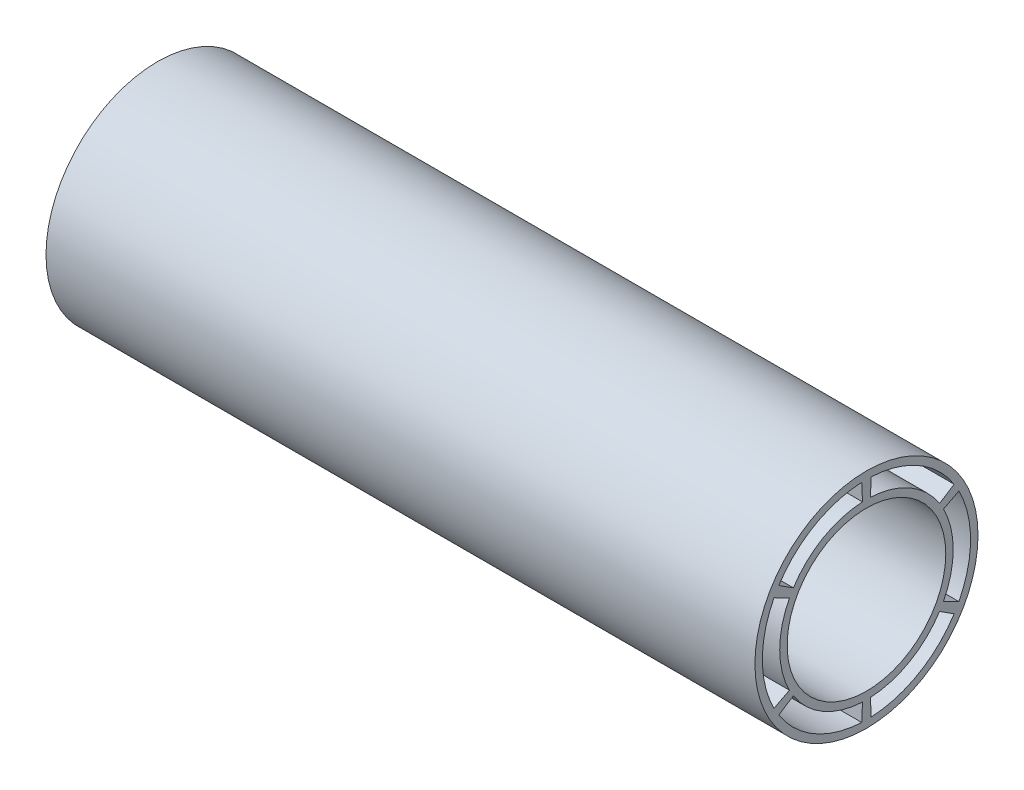
ISO-10303-21;
HEADER;
FILE_DESCRIPTION(('STEP AP214'),'2;1');
FILE_NAME('part.step','',(''),(''),'','','');
FILE_SCHEMA(('AUTOMOTIVE_DESIGN { 1 0 10303 214 1 1 1 1 }'));
ENDSEC;
DATA;
#1=APPLICATION_CONTEXT('core data for automotive mechanical design processes');
#2=APPLICATION_PROTOCOL_DEFINITION('international standard','automotive_design',2000,#1);
#3=PRODUCT_CONTEXT('',#1,'mechanical');
#4=PRODUCT('Part','Part','',(#3));
#5=PRODUCT_RELATED_PRODUCT_CATEGORY('part','',(#4));
#6=PRODUCT_DEFINITION_FORMATION('','',#4);
#7=PRODUCT_DEFINITION_CONTEXT('part definition',#1,'design');
#8=PRODUCT_DEFINITION('design','',#6,#7);
#9=PRODUCT_DEFINITION_SHAPE('','',#8);
#10=(LENGTH_UNIT() NAMED_UNIT(*) SI_UNIT(.MILLI.,.METRE.));
#11=(NAMED_UNIT(*) PLANE_ANGLE_UNIT() SI_UNIT($,.RADIAN.));
#12=(NAMED_UNIT(*) SI_UNIT($,.STERADIAN.) SOLID_ANGLE_UNIT());
#13=UNCERTAINTY_MEASURE_WITH_UNIT(LENGTH_MEASURE(1.E-05),#10,'distance_accuracy_value','');
#14=(GEOMETRIC_REPRESENTATION_CONTEXT(3) GLOBAL_UNCERTAINTY_ASSIGNED_CONTEXT((#13)) GLOBAL_UNIT_ASSIGNED_CONTEXT((#10,
#11,#12)) REPRESENTATION_CONTEXT('',''));
#15=CARTESIAN_POINT('',(0.,0.,0.));
#16=DIRECTION('',(0.,0.,1.));
#17=DIRECTION('',(1.,0.,0.));
#18=AXIS2_PLACEMENT_3D('',#15,#16,#17);
#19=CARTESIAN_POINT('',(143.,0.,0.));
#20=DIRECTION('',(-1.,0.,0.));
#21=DIRECTION('',(0.,0.,1.));
#22=AXIS2_PLACEMENT_3D('',#19,#20,#21);
#23=CYLINDRICAL_SURFACE('',#22,17.5);
#24=CARTESIAN_POINT('',(0.,0.,0.));
#25=DIRECTION('',(1.,0.,0.));
#26=DIRECTION('',(0.,0.,-1.));
#27=AXIS2_PLACEMENT_3D('',#24,#25,#26);
#28=CIRCLE('',#27,17.5);
#29=CARTESIAN_POINT('',(0.,9.43217489115371,-14.7405589046918));
#30=VERTEX_POINT('',#29);
#31=CARTESIAN_POINT('',(0.,17.4817859230209,-0.798223616331214));
#32=VERTEX_POINT('',#31);
#33=EDGE_CURVE('E292',#30,#32,#28,.T.);
#34=ORIENTED_EDGE('',*,*,#33,.T.);
#35=DIRECTION('',(-1.,0.,0.));
#36=VECTOR('',#35,1.);
#37=CARTESIAN_POINT('',(143.,17.4817859230209,-0.798223616331214));
#38=LINE('',#37,#36);
#39=CARTESIAN_POINT('',(143.,17.4817859230209,-0.798223616331214));
#40=VERTEX_POINT('',#39);
#41=EDGE_CURVE('E11',#40,#32,#38,.T.);
#42=ORIENTED_EDGE('',*,*,#41,.F.);
#43=CARTESIAN_POINT('',(143.,0.,0.));
#44=DIRECTION('',(1.,0.,0.));
#45=DIRECTION('',(0.,0.,-1.));
#46=AXIS2_PLACEMENT_3D('',#43,#44,#45);
#47=CIRCLE('',#46,17.5);
#48=CARTESIAN_POINT('',(143.,9.43217489115371,-14.7405589046918));
#49=VERTEX_POINT('',#48);
#50=EDGE_CURVE('E215',#49,#40,#47,.T.);
#51=ORIENTED_EDGE('',*,*,#50,.F.);
#52=DIRECTION('',(-1.,0.,0.));
#53=VECTOR('',#52,1.);
#54=CARTESIAN_POINT('',(143.,9.43217489115371,-14.7405589046918));
#55=LINE('',#54,#53);
#56=EDGE_CURVE('E58',#49,#30,#55,.T.);
#57=ORIENTED_EDGE('',*,*,#56,.T.);
#58=EDGE_LOOP('',(#34,#42,#51,#57));
#59=FACE_BOUND('',#58,.T.);
#60=ADVANCED_FACE('F39',(#59),#23,.T.);
#61=CARTESIAN_POINT('',(143.,0.,0.));
#62=DIRECTION('',(0.,0.0456127780760693,0.998959195601193));
#63=DIRECTION('',(0.,-0.998959195601194,0.0456127780760693));
#64=AXIS2_PLACEMENT_3D('',#61,#62,#63);
#65=PLANE('',#64);
#66=DIRECTION('',(0.,0.998959195601193,-0.0456127780760693));
#67=VECTOR('',#66,1.);
#68=CARTESIAN_POINT('',(0.,0.,0.));
#69=LINE('',#68,#67);
#70=CARTESIAN_POINT('',(0.,20.9781431076251,-0.957868339597456));
#71=VERTEX_POINT('',#70);
#72=EDGE_CURVE('E221',#32,#71,#69,.T.);
#73=ORIENTED_EDGE('',*,*,#72,.T.);
#74=DIRECTION('',(-1.,0.,0.));
#75=VECTOR('',#74,1.);
#76=CARTESIAN_POINT('',(143.,20.9781431076251,-0.957868339597456));
#77=LINE('',#76,#75);
#78=CARTESIAN_POINT('',(143.,20.9781431076251,-0.957868339597456));
#79=VERTEX_POINT('',#78);
#80=EDGE_CURVE('E49',#79,#71,#77,.T.);
#81=ORIENTED_EDGE('',*,*,#80,.F.);
#82=DIRECTION('',(0.,0.998959195601193,-0.0456127780760693));
#83=VECTOR('',#82,1.);
#84=CARTESIAN_POINT('',(143.,0.,0.));
#85=LINE('',#84,#83);
#86=EDGE_CURVE('E208',#40,#79,#85,.T.);
#87=ORIENTED_EDGE('',*,*,#86,.F.);
#88=ORIENTED_EDGE('',*,*,#41,.T.);
#89=EDGE_LOOP('',(#73,#81,#87,#88));
#90=FACE_BOUND('',#89,.T.);
#91=ADVANCED_FACE('F220',(#90),#65,.F.);
#92=CARTESIAN_POINT('',(143.,0.,0.));
#93=DIRECTION('',(-1.,0.,0.));
#94=DIRECTION('',(0.,0.,1.));
#95=AXIS2_PLACEMENT_3D('',#92,#93,#94);
#96=CYLINDRICAL_SURFACE('',#95,21.);
#97=CARTESIAN_POINT('',(0.,0.,0.));
#98=DIRECTION('',(1.,0.,0.));
#99=DIRECTION('',(0.,0.,-1.));
#100=AXIS2_PLACEMENT_3D('',#97,#98,#99);
#101=CIRCLE('',#100,21.);
#102=CARTESIAN_POINT('',(0.,11.3186098693845,-17.6886706856302));
#103=VERTEX_POINT('',#102);
#104=EDGE_CURVE('E300',#103,#71,#101,.T.);
#105=ORIENTED_EDGE('',*,*,#104,.F.);
#106=DIRECTION('',(-1.,0.,0.));
#107=VECTOR('',#106,1.);
#108=CARTESIAN_POINT('',(143.,11.3186098693845,-17.6886706856302));
#109=LINE('',#108,#107);
#110=CARTESIAN_POINT('',(143.,11.3186098693845,-17.6886706856302));
#111=VERTEX_POINT('',#110);
#112=EDGE_CURVE('E132',#111,#103,#109,.T.);
#113=ORIENTED_EDGE('',*,*,#112,.F.);
#114=CARTESIAN_POINT('',(143.,0.,0.));
#115=DIRECTION('',(1.,0.,0.));
#116=DIRECTION('',(0.,0.,-1.));
#117=AXIS2_PLACEMENT_3D('',#114,#115,#116);
#118=CIRCLE('',#117,21.);
#119=EDGE_CURVE('E214',#111,#79,#118,.T.);
#120=ORIENTED_EDGE('',*,*,#119,.T.);
#121=ORIENTED_EDGE('',*,*,#80,.T.);
#122=EDGE_LOOP('',(#105,#113,#120,#121));
#123=FACE_BOUND('',#122,.T.);
#124=ADVANCED_FACE('F225',(#123),#96,.F.);
#125=CARTESIAN_POINT('',(143.,0.,0.));
#126=DIRECTION('',(0.,-0.0456127780760554,0.998959195601194));
#127=DIRECTION('',(0.,-0.998959195601194,-0.0456127780760554));
#128=AXIS2_PLACEMENT_3D('',#125,#126,#127);
#129=PLANE('',#128);
#130=DIRECTION('',(0.,0.998959195601194,0.0456127780760554));
#131=VECTOR('',#130,1.);
#132=CARTESIAN_POINT('',(0.,0.,0.));
#133=LINE('',#132,#131);
#134=CARTESIAN_POINT('',(0.,17.4817859230209,0.798223616330969));
#135=VERTEX_POINT('',#134);
#136=CARTESIAN_POINT('',(0.,20.9781431076251,0.957868339597162));
#137=VERTEX_POINT('',#136);
#138=EDGE_CURVE('E323',#135,#137,#133,.T.);
#139=ORIENTED_EDGE('',*,*,#138,.F.);
#140=DIRECTION('',(-1.,0.,0.));
#141=VECTOR('',#140,1.);
#142=CARTESIAN_POINT('',(143.,17.4817859230209,0.798223616330969));
#143=LINE('',#142,#141);
#144=CARTESIAN_POINT('',(143.,17.4817859230209,0.798223616330969));
#145=VERTEX_POINT('',#144);
#146=EDGE_CURVE('E343',#145,#135,#143,.T.);
#147=ORIENTED_EDGE('',*,*,#146,.F.);
#148=DIRECTION('',(0.,0.998959195601194,0.0456127780760554));
#149=VECTOR('',#148,1.);
#150=CARTESIAN_POINT('',(143.,0.,0.));
#151=LINE('',#150,#149);
#152=CARTESIAN_POINT('',(143.,20.9781431076251,0.957868339597162));
#153=VERTEX_POINT('',#152);
#154=EDGE_CURVE('E266',#145,#153,#151,.T.);
#155=ORIENTED_EDGE('',*,*,#154,.T.);
#156=DIRECTION('',(-1.,0.,0.));
#157=VECTOR('',#156,1.);
#158=CARTESIAN_POINT('',(143.,20.9781431076251,0.957868339597162));
#159=LINE('',#158,#157);
#160=EDGE_CURVE('E345',#153,#137,#159,.T.);
#161=ORIENTED_EDGE('',*,*,#160,.T.);
#162=EDGE_LOOP('',(#139,#147,#155,#161));
#163=FACE_BOUND('',#162,.T.);
#164=ADVANCED_FACE('F420',(#163),#129,.T.);
#165=CARTESIAN_POINT('',(0.,9.43217489115392,14.7405589046917));
#166=VERTEX_POINT('',#165);
#167=EDGE_CURVE('E326',#135,#166,#28,.T.);
#168=ORIENTED_EDGE('',*,*,#167,.T.);
#169=DIRECTION('',(-1.,0.,0.));
#170=VECTOR('',#169,1.);
#171=CARTESIAN_POINT('',(143.,9.43217489115392,14.7405589046917));
#172=LINE('',#171,#170);
#173=CARTESIAN_POINT('',(143.,9.43217489115392,14.7405589046917));
#174=VERTEX_POINT('',#173);
#175=EDGE_CURVE('E350',#174,#166,#172,.T.);
#176=ORIENTED_EDGE('',*,*,#175,.F.);
#177=EDGE_CURVE('E271',#145,#174,#47,.T.);
#178=ORIENTED_EDGE('',*,*,#177,.F.);
#179=ORIENTED_EDGE('',*,*,#146,.T.);
#180=EDGE_LOOP('',(#168,#176,#178,#179));
#181=FACE_BOUND('',#180,.T.);
#182=ADVANCED_FACE('F412',(#181),#23,.T.);
#183=CARTESIAN_POINT('',(143.,0.,0.));
#184=DIRECTION('',(0.,-0.842317651696668,0.538981422351653));
#185=DIRECTION('',(0.,-0.538981422351653,-0.842317651696668));
#186=AXIS2_PLACEMENT_3D('',#183,#184,#185);
#187=PLANE('',#186);
#188=DIRECTION('',(0.,0.538981422351653,0.842317651696668));
#189=VECTOR('',#188,1.);
#190=CARTESIAN_POINT('',(0.,0.,0.));
#191=LINE('',#190,#189);
#192=CARTESIAN_POINT('',(0.,11.3186098693847,17.68867068563));
#193=VERTEX_POINT('',#192);
#194=EDGE_CURVE('E327',#166,#193,#191,.T.);
#195=ORIENTED_EDGE('',*,*,#194,.T.);
#196=DIRECTION('',(-1.,0.,0.));
#197=VECTOR('',#196,1.);
#198=CARTESIAN_POINT('',(143.,11.3186098693847,17.68867068563));
#199=LINE('',#198,#197);
#200=CARTESIAN_POINT('',(143.,11.3186098693847,17.68867068563));
#201=VERTEX_POINT('',#200);
#202=EDGE_CURVE('E347',#201,#193,#199,.T.);
#203=ORIENTED_EDGE('',*,*,#202,.F.);
#204=DIRECTION('',(0.,0.538981422351653,0.842317651696668));
#205=VECTOR('',#204,1.);
#206=CARTESIAN_POINT('',(143.,0.,0.));
#207=LINE('',#206,#205);
#208=EDGE_CURVE('E235',#174,#201,#207,.T.);
#209=ORIENTED_EDGE('',*,*,#208,.F.);
#210=ORIENTED_EDGE('',*,*,#175,.T.);
#211=EDGE_LOOP('',(#195,#203,#209,#210));
#212=FACE_BOUND('',#211,.T.);
#213=ADVANCED_FACE('F419',(#212),#187,.F.);
#214=CARTESIAN_POINT('',(143.,0.,0.));
#215=DIRECTION('',(0.,-0.887930429772731,0.459977773249549));
#216=DIRECTION('',(0.,-0.459977773249549,-0.887930429772731));
#217=AXIS2_PLACEMENT_3D('',#214,#215,#216);
#218=PLANE('',#217);
#219=DIRECTION('',(0.,0.459977773249549,0.887930429772731));
#220=VECTOR('',#219,1.);
#221=CARTESIAN_POINT('',(0.,0.,0.));
#222=LINE('',#221,#220);
#223=CARTESIAN_POINT('',(0.,8.04961103186711,15.5387825210228));
#224=VERTEX_POINT('',#223);
#225=CARTESIAN_POINT('',(0.,9.65953323824053,18.6465390252274));
#226=VERTEX_POINT('',#225);
#227=EDGE_CURVE('E315',#224,#226,#222,.T.);
#228=ORIENTED_EDGE('',*,*,#227,.F.);
#229=DIRECTION('',(-1.,0.,0.));
#230=VECTOR('',#229,1.);
#231=CARTESIAN_POINT('',(143.,8.04961103186711,15.5387825210228));
#232=LINE('',#231,#230);
#233=CARTESIAN_POINT('',(143.,8.04961103186711,15.5387825210228));
#234=VERTEX_POINT('',#233);
#235=EDGE_CURVE('E348',#234,#224,#232,.T.);
#236=ORIENTED_EDGE('',*,*,#235,.F.);
#237=DIRECTION('',(0.,0.459977773249549,0.887930429772731));
#238=VECTOR('',#237,1.);
#239=CARTESIAN_POINT('',(143.,0.,0.));
#240=LINE('',#239,#238);
#241=CARTESIAN_POINT('',(143.,9.65953323824053,18.6465390252274));
#242=VERTEX_POINT('',#241);
#243=EDGE_CURVE('E257',#234,#242,#240,.T.);
#244=ORIENTED_EDGE('',*,*,#243,.T.);
#245=DIRECTION('',(-1.,0.,0.));
#246=VECTOR('',#245,1.);
#247=CARTESIAN_POINT('',(143.,9.65953323824053,18.6465390252274));
#248=LINE('',#247,#246);
#249=EDGE_CURVE('E354',#242,#226,#248,.T.);
#250=ORIENTED_EDGE('',*,*,#249,.T.);
#251=EDGE_LOOP('',(#228,#236,#244,#250));
#252=FACE_BOUND('',#251,.T.);
#253=ADVANCED_FACE('F427',(#252),#218,.T.);
#254=CARTESIAN_POINT('',(0.,-8.049611031867,15.5387825210228));
#255=VERTEX_POINT('',#254);
#256=EDGE_CURVE('E318',#224,#255,#28,.T.);
#257=ORIENTED_EDGE('',*,*,#256,.T.);
#258=DIRECTION('',(-1.,0.,0.));
#259=VECTOR('',#258,1.);
#260=CARTESIAN_POINT('',(143.,-8.049611031867,15.5387825210228));
#261=LINE('',#260,#259);
#262=CARTESIAN_POINT('',(143.,-8.049611031867,15.5387825210228));
#263=VERTEX_POINT('',#262);
#264=EDGE_CURVE('E359',#263,#255,#261,.T.);
#265=ORIENTED_EDGE('',*,*,#264,.F.);
#266=EDGE_CURVE('E262',#234,#263,#47,.T.);
#267=ORIENTED_EDGE('',*,*,#266,.F.);
#268=ORIENTED_EDGE('',*,*,#235,.T.);
#269=EDGE_LOOP('',(#257,#265,#267,#268));
#270=FACE_BOUND('',#269,.T.);
#271=ADVANCED_FACE('F422',(#270),#23,.T.);
#272=CARTESIAN_POINT('',(143.,0.,0.));
#273=DIRECTION('',(0.,-0.887930429772734,-0.459977773249543));
#274=DIRECTION('',(0.,0.459977773249543,-0.887930429772734));
#275=AXIS2_PLACEMENT_3D('',#272,#273,#274);
#276=PLANE('',#275);
#277=DIRECTION('',(0.,-0.459977773249543,0.887930429772734));
#278=VECTOR('',#277,1.);
#279=CARTESIAN_POINT('',(0.,0.,0.));
#280=LINE('',#279,#278);
#281=CARTESIAN_POINT('',(0.,-9.6595332382404,18.6465390252274));
#282=VERTEX_POINT('',#281);
#283=EDGE_CURVE('E319',#255,#282,#280,.T.);
#284=ORIENTED_EDGE('',*,*,#283,.T.);
#285=DIRECTION('',(-1.,0.,0.));
#286=VECTOR('',#285,1.);
#287=CARTESIAN_POINT('',(143.,-9.6595332382404,18.6465390252274));
#288=LINE('',#287,#286);
#289=CARTESIAN_POINT('',(143.,-9.6595332382404,18.6465390252274));
#290=VERTEX_POINT('',#289);
#291=EDGE_CURVE('E356',#290,#282,#288,.T.);
#292=ORIENTED_EDGE('',*,*,#291,.F.);
#293=DIRECTION('',(0.,-0.459977773249543,0.887930429772734));
#294=VECTOR('',#293,1.);
#295=CARTESIAN_POINT('',(143.,0.,0.));
#296=LINE('',#295,#294);
#297=EDGE_CURVE('E267',#263,#290,#296,.T.);
#298=ORIENTED_EDGE('',*,*,#297,.F.);
#299=ORIENTED_EDGE('',*,*,#264,.T.);
#300=EDGE_LOOP('',(#284,#292,#298,#299));
#301=FACE_BOUND('',#300,.T.);
#302=ADVANCED_FACE('F433',(#301),#276,.F.);
#303=CARTESIAN_POINT('',(143.,0.,0.));
#304=DIRECTION('',(0.,-0.842317651696672,-0.538981422351647));
#305=DIRECTION('',(0.,0.538981422351647,-0.842317651696672));
#306=AXIS2_PLACEMENT_3D('',#303,#304,#305);
#307=PLANE('',#306);
#308=DIRECTION('',(0.,-0.538981422351647,0.842317651696672));
#309=VECTOR('',#308,1.);
#310=CARTESIAN_POINT('',(0.,0.,0.));
#311=LINE('',#310,#309);
#312=CARTESIAN_POINT('',(0.,-9.43217489115382,14.7405589046918));
#313=VERTEX_POINT('',#312);
#314=CARTESIAN_POINT('',(0.,-11.3186098693846,17.6886706856301));
#315=VERTEX_POINT('',#314);
#316=EDGE_CURVE('E307',#313,#315,#311,.T.);
#317=ORIENTED_EDGE('',*,*,#316,.F.);
#318=DIRECTION('',(-1.,0.,0.));
#319=VECTOR('',#318,1.);
#320=CARTESIAN_POINT('',(143.,-9.43217489115382,14.7405589046918));
#321=LINE('',#320,#319);
#322=CARTESIAN_POINT('',(143.,-9.43217489115382,14.7405589046918));
#323=VERTEX_POINT('',#322);
#324=EDGE_CURVE('E357',#323,#313,#321,.T.);
#325=ORIENTED_EDGE('',*,*,#324,.F.);
#326=DIRECTION('',(0.,-0.538981422351647,0.842317651696672));
#327=VECTOR('',#326,1.);
#328=CARTESIAN_POINT('',(143.,0.,0.));
#329=LINE('',#328,#327);
#330=CARTESIAN_POINT('',(143.,-11.3186098693846,17.6886706856301));
#331=VERTEX_POINT('',#330);
#332=EDGE_CURVE('E247',#323,#331,#329,.T.);
#333=ORIENTED_EDGE('',*,*,#332,.T.);
#334=DIRECTION('',(-1.,0.,0.));
#335=VECTOR('',#334,1.);
#336=CARTESIAN_POINT('',(143.,-11.3186098693846,17.6886706856301));
#337=LINE('',#336,#335);
#338=EDGE_CURVE('E363',#331,#315,#337,.T.);
#339=ORIENTED_EDGE('',*,*,#338,.T.);
#340=EDGE_LOOP('',(#317,#325,#333,#339));
#341=FACE_BOUND('',#340,.T.);
#342=ADVANCED_FACE('F440',(#341),#307,.T.);
#343=CARTESIAN_POINT('',(0.,-17.4817859230209,0.798223616331091));
#344=VERTEX_POINT('',#343);
#345=EDGE_CURVE('E310',#313,#344,#28,.T.);
#346=ORIENTED_EDGE('',*,*,#345,.T.);
#347=DIRECTION('',(-1.,0.,0.));
#348=VECTOR('',#347,1.);
#349=CARTESIAN_POINT('',(143.,-17.4817859230209,0.798223616331091));
#350=LINE('',#349,#348);
#351=CARTESIAN_POINT('',(143.,-17.4817859230209,0.798223616331091));
#352=VERTEX_POINT('',#351);
#353=EDGE_CURVE('E368',#352,#344,#350,.T.);
#354=ORIENTED_EDGE('',*,*,#353,.F.);
#355=EDGE_CURVE('E253',#323,#352,#47,.T.);
#356=ORIENTED_EDGE('',*,*,#355,.F.);
#357=ORIENTED_EDGE('',*,*,#324,.T.);
#358=EDGE_LOOP('',(#346,#354,#356,#357));
#359=FACE_BOUND('',#358,.T.);
#360=ADVANCED_FACE('F435',(#359),#23,.T.);
#361=CARTESIAN_POINT('',(143.,0.,0.));
#362=DIRECTION('',(0.,-0.0456127780760623,-0.998959195601194));
#363=DIRECTION('',(0.,0.998959195601194,-0.0456127780760623));
#364=AXIS2_PLACEMENT_3D('',#361,#362,#363);
#365=PLANE('',#364);
#366=DIRECTION('',(0.,-0.998959195601194,0.0456127780760623));
#367=VECTOR('',#366,1.);
#368=CARTESIAN_POINT('',(0.,0.,0.));
#369=LINE('',#368,#367);
#370=CARTESIAN_POINT('',(0.,-20.9781431076251,0.957868339597309));
#371=VERTEX_POINT('',#370);
#372=EDGE_CURVE('E311',#344,#371,#369,.T.);
#373=ORIENTED_EDGE('',*,*,#372,.T.);
#374=DIRECTION('',(-1.,0.,0.));
#375=VECTOR('',#374,1.);
#376=CARTESIAN_POINT('',(143.,-20.9781431076251,0.957868339597309));
#377=LINE('',#376,#375);
#378=CARTESIAN_POINT('',(143.,-20.9781431076251,0.957868339597309));
#379=VERTEX_POINT('',#378);
#380=EDGE_CURVE('E365',#379,#371,#377,.T.);
#381=ORIENTED_EDGE('',*,*,#380,.F.);
#382=DIRECTION('',(0.,-0.998959195601194,0.0456127780760623));
#383=VECTOR('',#382,1.);
#384=CARTESIAN_POINT('',(143.,0.,0.));
#385=LINE('',#384,#383);
#386=EDGE_CURVE('E258',#352,#379,#385,.T.);
#387=ORIENTED_EDGE('',*,*,#386,.F.);
#388=ORIENTED_EDGE('',*,*,#353,.T.);
#389=EDGE_LOOP('',(#373,#381,#387,#388));
#390=FACE_BOUND('',#389,.T.);
#391=ADVANCED_FACE('F447',(#390),#365,.F.);
#392=CARTESIAN_POINT('',(143.,0.,0.));
#393=DIRECTION('',(0.,0.0456127780760623,-0.998959195601194));
#394=DIRECTION('',(0.,0.998959195601194,0.0456127780760623));
#395=AXIS2_PLACEMENT_3D('',#392,#393,#394);
#396=PLANE('',#395);
#397=DIRECTION('',(0.,-0.998959195601194,-0.0456127780760623));
#398=VECTOR('',#397,1.);
#399=CARTESIAN_POINT('',(0.,0.,0.));
#400=LINE('',#399,#398);
#401=CARTESIAN_POINT('',(0.,-17.4817859230209,-0.798223616331091));
#402=VERTEX_POINT('',#401);
#403=CARTESIAN_POINT('',(0.,-20.9781431076251,-0.957868339597309));
#404=VERTEX_POINT('',#403);
#405=EDGE_CURVE('E299',#402,#404,#400,.T.);
#406=ORIENTED_EDGE('',*,*,#405,.F.);
#407=DIRECTION('',(-1.,0.,0.));
#408=VECTOR('',#407,1.);
#409=CARTESIAN_POINT('',(143.,-17.4817859230209,-0.798223616331091));
#410=LINE('',#409,#408);
#411=CARTESIAN_POINT('',(143.,-17.4817859230209,-0.798223616331091));
#412=VERTEX_POINT('',#411);
#413=EDGE_CURVE('E366',#412,#402,#410,.T.);
#414=ORIENTED_EDGE('',*,*,#413,.F.);
#415=DIRECTION('',(0.,-0.998959195601194,-0.0456127780760623));
#416=VECTOR('',#415,1.);
#417=CARTESIAN_POINT('',(143.,0.,0.));
#418=LINE('',#417,#416);
#419=CARTESIAN_POINT('',(143.,-20.9781431076251,-0.957868339597309));
#420=VERTEX_POINT('',#419);
#421=EDGE_CURVE('E238',#412,#420,#418,.T.);
#422=ORIENTED_EDGE('',*,*,#421,.T.);
#423=DIRECTION('',(-1.,0.,0.));
#424=VECTOR('',#423,1.);
#425=CARTESIAN_POINT('',(143.,-20.9781431076251,-0.957868339597309));
#426=LINE('',#425,#424);
#427=EDGE_CURVE('E372',#420,#404,#426,.T.);
#428=ORIENTED_EDGE('',*,*,#427,.T.);
#429=EDGE_LOOP('',(#406,#414,#422,#428));
#430=FACE_BOUND('',#429,.T.);
#431=ADVANCED_FACE('F453',(#430),#396,.T.);
#432=CARTESIAN_POINT('',(0.,-9.43217489115402,-14.7405589046916));
#433=VERTEX_POINT('',#432);
#434=EDGE_CURVE('E293',#402,#433,#28,.T.);
#435=ORIENTED_EDGE('',*,*,#434,.T.);
#436=DIRECTION('',(-1.,0.,0.));
#437=VECTOR('',#436,1.);
#438=CARTESIAN_POINT('',(143.,-9.43217489115402,-14.7405589046916));
#439=LINE('',#438,#437);
#440=CARTESIAN_POINT('',(143.,-9.43217489115402,-14.7405589046916));
#441=VERTEX_POINT('',#440);
#442=EDGE_CURVE('E376',#441,#433,#439,.T.);
#443=ORIENTED_EDGE('',*,*,#442,.F.);
#444=EDGE_CURVE('E244',#412,#441,#47,.T.);
#445=ORIENTED_EDGE('',*,*,#444,.F.);
#446=ORIENTED_EDGE('',*,*,#413,.T.);
#447=EDGE_LOOP('',(#435,#443,#445,#446));
#448=FACE_BOUND('',#447,.T.);
#449=ADVANCED_FACE('F409',(#448),#23,.T.);
#450=CARTESIAN_POINT('',(143.,0.,0.));
#451=DIRECTION('',(0.,0.842317651696664,-0.538981422351659));
#452=DIRECTION('',(0.,0.538981422351659,0.842317651696664));
#453=AXIS2_PLACEMENT_3D('',#450,#451,#452);
#454=PLANE('',#453);
#455=DIRECTION('',(0.,-0.538981422351659,-0.842317651696664));
#456=VECTOR('',#455,1.);
#457=CARTESIAN_POINT('',(0.,0.,0.));
#458=LINE('',#457,#456);
#459=CARTESIAN_POINT('',(0.,-11.3186098693848,-17.6886706856299));
#460=VERTEX_POINT('',#459);
#461=EDGE_CURVE('E304',#433,#460,#458,.T.);
#462=ORIENTED_EDGE('',*,*,#461,.T.);
#463=DIRECTION('',(-1.,0.,0.));
#464=VECTOR('',#463,1.);
#465=CARTESIAN_POINT('',(143.,-11.3186098693848,-17.6886706856299));
#466=LINE('',#465,#464);
#467=CARTESIAN_POINT('',(143.,-11.3186098693848,-17.6886706856299));
#468=VERTEX_POINT('',#467);
#469=EDGE_CURVE('E374',#468,#460,#466,.T.);
#470=ORIENTED_EDGE('',*,*,#469,.F.);
#471=DIRECTION('',(0.,-0.538981422351659,-0.842317651696664));
#472=VECTOR('',#471,1.);
#473=CARTESIAN_POINT('',(143.,0.,0.));
#474=LINE('',#473,#472);
#475=EDGE_CURVE('E248',#441,#468,#474,.T.);
#476=ORIENTED_EDGE('',*,*,#475,.F.);
#477=ORIENTED_EDGE('',*,*,#442,.T.);
#478=EDGE_LOOP('',(#462,#470,#476,#477));
#479=FACE_BOUND('',#478,.T.);
#480=ADVANCED_FACE('F460',(#479),#454,.F.);
#481=CARTESIAN_POINT('',(143.,0.,0.));
#482=DIRECTION('',(0.,0.887930429772728,-0.459977773249555));
#483=DIRECTION('',(0.,0.459977773249555,0.887930429772728));
#484=AXIS2_PLACEMENT_3D('',#481,#482,#483);
#485=PLANE('',#484);
#486=DIRECTION('',(0.,-0.459977773249555,-0.887930429772728));
#487=VECTOR('',#486,1.);
#488=CARTESIAN_POINT('',(0.,0.,0.));
#489=LINE('',#488,#487);
#490=CARTESIAN_POINT('',(0.,-8.04961103186722,-15.5387825210227));
#491=VERTEX_POINT('',#490);
#492=CARTESIAN_POINT('',(0.,-9.65953323824066,-18.6465390252273));
#493=VERTEX_POINT('',#492);
#494=EDGE_CURVE('E286',#491,#493,#489,.T.);
#495=ORIENTED_EDGE('',*,*,#494,.F.);
#496=DIRECTION('',(-1.,0.,0.));
#497=VECTOR('',#496,1.);
#498=CARTESIAN_POINT('',(143.,-8.04961103186722,-15.5387825210227));
#499=LINE('',#498,#497);
#500=CARTESIAN_POINT('',(143.,-8.04961103186722,-15.5387825210227));
#501=VERTEX_POINT('',#500);
#502=EDGE_CURVE('E43',#501,#491,#499,.T.);
#503=ORIENTED_EDGE('',*,*,#502,.F.);
#504=DIRECTION('',(0.,-0.459977773249555,-0.887930429772728));
#505=VECTOR('',#504,1.);
#506=CARTESIAN_POINT('',(143.,0.,0.));
#507=LINE('',#506,#505);
#508=CARTESIAN_POINT('',(143.,-9.65953323824066,-18.6465390252273));
#509=VERTEX_POINT('',#508);
#510=EDGE_CURVE('E341',#501,#509,#507,.T.);
#511=ORIENTED_EDGE('',*,*,#510,.T.);
#512=DIRECTION('',(-1.,0.,0.));
#513=VECTOR('',#512,1.);
#514=CARTESIAN_POINT('',(143.,-9.65953323824066,-18.6465390252273));
#515=LINE('',#514,#513);
#516=EDGE_CURVE('E285',#509,#493,#515,.T.);
#517=ORIENTED_EDGE('',*,*,#516,.T.);
#518=EDGE_LOOP('',(#495,#503,#511,#517));
#519=FACE_BOUND('',#518,.T.);
#520=ADVANCED_FACE('F41',(#519),#485,.T.);
#521=CARTESIAN_POINT('',(0.,8.04961103186689,-15.5387825210229));
#522=VERTEX_POINT('',#521);
#523=EDGE_CURVE('E289',#491,#522,#28,.T.);
#524=ORIENTED_EDGE('',*,*,#523,.T.);
#525=DIRECTION('',(-1.,0.,0.));
#526=VECTOR('',#525,1.);
#527=CARTESIAN_POINT('',(143.,8.04961103186689,-15.5387825210229));
#528=LINE('',#527,#526);
#529=CARTESIAN_POINT('',(143.,8.04961103186689,-15.5387825210229));
#530=VERTEX_POINT('',#529);
#531=EDGE_CURVE('E382',#530,#522,#528,.T.);
#532=ORIENTED_EDGE('',*,*,#531,.F.);
#533=EDGE_CURVE('E245',#501,#530,#47,.T.);
#534=ORIENTED_EDGE('',*,*,#533,.F.);
#535=ORIENTED_EDGE('',*,*,#502,.T.);
#536=EDGE_LOOP('',(#524,#532,#534,#535));
#537=FACE_BOUND('',#536,.T.);
#538=ADVANCED_FACE('F390',(#537),#23,.T.);
#539=CARTESIAN_POINT('',(143.,0.,0.));
#540=DIRECTION('',(0.,0.887930429772737,0.459977773249536));
#541=DIRECTION('',(0.,-0.459977773249536,0.887930429772737));
#542=AXIS2_PLACEMENT_3D('',#539,#540,#541);
#543=PLANE('',#542);
#544=DIRECTION('',(0.,0.459977773249536,-0.887930429772738));
#545=VECTOR('',#544,1.);
#546=CARTESIAN_POINT('',(0.,0.,0.));
#547=LINE('',#546,#545);
#548=CARTESIAN_POINT('',(0.,9.65953323824027,-18.6465390252275));
#549=VERTEX_POINT('',#548);
#550=EDGE_CURVE('E291',#522,#549,#547,.T.);
#551=ORIENTED_EDGE('',*,*,#550,.T.);
#552=DIRECTION('',(-1.,0.,0.));
#553=VECTOR('',#552,1.);
#554=CARTESIAN_POINT('',(143.,9.65953323824027,-18.6465390252275));
#555=LINE('',#554,#553);
#556=CARTESIAN_POINT('',(143.,9.65953323824027,-18.6465390252275));
#557=VERTEX_POINT('',#556);
#558=EDGE_CURVE('E381',#557,#549,#555,.T.);
#559=ORIENTED_EDGE('',*,*,#558,.F.);
#560=DIRECTION('',(0.,0.459977773249536,-0.887930429772738));
#561=VECTOR('',#560,1.);
#562=CARTESIAN_POINT('',(143.,0.,0.));
#563=LINE('',#562,#561);
#564=EDGE_CURVE('E239',#530,#557,#563,.T.);
#565=ORIENTED_EDGE('',*,*,#564,.F.);
#566=ORIENTED_EDGE('',*,*,#531,.T.);
#567=EDGE_LOOP('',(#551,#559,#565,#566));
#568=FACE_BOUND('',#567,.T.);
#569=ADVANCED_FACE('F398',(#568),#543,.F.);
#570=CARTESIAN_POINT('',(143.,0.,0.));
#571=DIRECTION('',(-1.,0.,0.));
#572=DIRECTION('',(0.,0.,1.));
#573=AXIS2_PLACEMENT_3D('',#570,#571,#572);
#574=CYLINDRICAL_SURFACE('',#573,22.5);
#575=CARTESIAN_POINT('',(143.,0.,0.));
#576=DIRECTION('',(1.,0.,0.));
#577=DIRECTION('',(0.,0.,-1.));
#578=AXIS2_PLACEMENT_3D('',#575,#576,#577);
#579=CIRCLE('',#578,22.5);
#580=CARTESIAN_POINT('',(143.,0.,-22.5));
#581=VERTEX_POINT('',#580);
#582=EDGE_CURVE('E230',#581,#581,#579,.T.);
#583=ORIENTED_EDGE('',*,*,#582,.F.);
#584=EDGE_LOOP('',(#583));
#585=FACE_BOUND('',#584,.T.);
#586=CARTESIAN_POINT('',(0.,0.,0.));
#587=DIRECTION('',(1.,0.,0.));
#588=DIRECTION('',(0.,0.,-1.));
#589=AXIS2_PLACEMENT_3D('',#586,#587,#588);
#590=CIRCLE('',#589,22.5);
#591=CARTESIAN_POINT('',(0.,0.,-22.5));
#592=VERTEX_POINT('',#591);
#593=EDGE_CURVE('E335',#592,#592,#590,.T.);
#594=ORIENTED_EDGE('',*,*,#593,.T.);
#595=EDGE_LOOP('',(#594));
#596=FACE_BOUND('',#595,.T.);
#597=ADVANCED_FACE('F400',(#585,#596),#574,.T.);
#598=CARTESIAN_POINT('',(143.,0.,0.));
#599=DIRECTION('',(0.,0.842317651696675,0.538981422351641));
#600=DIRECTION('',(0.,-0.538981422351642,0.842317651696675));
#601=AXIS2_PLACEMENT_3D('',#598,#599,#600);
#602=PLANE('',#601);
#603=DIRECTION('',(0.,0.538981422351641,-0.842317651696675));
#604=VECTOR('',#603,1.);
#605=CARTESIAN_POINT('',(0.,0.,0.));
#606=LINE('',#605,#604);
#607=EDGE_CURVE('E332',#30,#103,#606,.T.);
#608=ORIENTED_EDGE('',*,*,#607,.F.);
#609=ORIENTED_EDGE('',*,*,#56,.F.);
#610=DIRECTION('',(0.,0.538981422351641,-0.842317651696675));
#611=VECTOR('',#610,1.);
#612=CARTESIAN_POINT('',(143.,0.,0.));
#613=LINE('',#612,#611);
#614=EDGE_CURVE('E226',#49,#111,#613,.T.);
#615=ORIENTED_EDGE('',*,*,#614,.T.);
#616=ORIENTED_EDGE('',*,*,#112,.T.);
#617=EDGE_LOOP('',(#608,#609,#615,#616));
#618=FACE_BOUND('',#617,.T.);
#619=ADVANCED_FACE('F405',(#618),#602,.T.);
#620=EDGE_CURVE('E330',#137,#193,#101,.T.);
#621=ORIENTED_EDGE('',*,*,#620,.F.);
#622=ORIENTED_EDGE('',*,*,#160,.F.);
#623=EDGE_CURVE('E228',#153,#201,#118,.T.);
#624=ORIENTED_EDGE('',*,*,#623,.T.);
#625=ORIENTED_EDGE('',*,*,#202,.T.);
#626=EDGE_LOOP('',(#621,#622,#624,#625));
#627=FACE_BOUND('',#626,.T.);
#628=ADVANCED_FACE('F487',(#627),#96,.F.);
#629=EDGE_CURVE('E322',#226,#282,#101,.T.);
#630=ORIENTED_EDGE('',*,*,#629,.F.);
#631=ORIENTED_EDGE('',*,*,#249,.F.);
#632=EDGE_CURVE('E236',#242,#290,#118,.T.);
#633=ORIENTED_EDGE('',*,*,#632,.T.);
#634=ORIENTED_EDGE('',*,*,#291,.T.);
#635=EDGE_LOOP('',(#630,#631,#633,#634));
#636=FACE_BOUND('',#635,.T.);
#637=ADVANCED_FACE('F492',(#636),#96,.F.);
#638=EDGE_CURVE('E314',#315,#371,#101,.T.);
#639=ORIENTED_EDGE('',*,*,#638,.F.);
#640=ORIENTED_EDGE('',*,*,#338,.F.);
#641=EDGE_CURVE('E249',#331,#379,#118,.T.);
#642=ORIENTED_EDGE('',*,*,#641,.T.);
#643=ORIENTED_EDGE('',*,*,#380,.T.);
#644=EDGE_LOOP('',(#639,#640,#642,#643));
#645=FACE_BOUND('',#644,.T.);
#646=ADVANCED_FACE('F507',(#645),#96,.F.);
#647=EDGE_CURVE('E301',#404,#460,#101,.T.);
#648=ORIENTED_EDGE('',*,*,#647,.F.);
#649=ORIENTED_EDGE('',*,*,#427,.F.);
#650=EDGE_CURVE('E240',#420,#468,#118,.T.);
#651=ORIENTED_EDGE('',*,*,#650,.T.);
#652=ORIENTED_EDGE('',*,*,#469,.T.);
#653=EDGE_LOOP('',(#648,#649,#651,#652));
#654=FACE_BOUND('',#653,.T.);
#655=ADVANCED_FACE('F501',(#654),#96,.F.);
#656=EDGE_CURVE('E296',#493,#549,#101,.T.);
#657=ORIENTED_EDGE('',*,*,#656,.F.);
#658=ORIENTED_EDGE('',*,*,#516,.F.);
#659=EDGE_CURVE('E229',#509,#557,#118,.T.);
#660=ORIENTED_EDGE('',*,*,#659,.T.);
#661=ORIENTED_EDGE('',*,*,#558,.T.);
#662=EDGE_LOOP('',(#657,#658,#660,#661));
#663=FACE_BOUND('',#662,.T.);
#664=ADVANCED_FACE('F396',(#663),#96,.F.);
#665=CARTESIAN_POINT('',(143.,0.,0.));
#666=DIRECTION('',(-1.,0.,0.));
#667=DIRECTION('',(0.,0.,1.));
#668=AXIS2_PLACEMENT_3D('',#665,#666,#667);
#669=CYLINDRICAL_SURFACE('',#668,16.);
#670=CARTESIAN_POINT('',(143.,0.,0.));
#671=DIRECTION('',(1.,0.,0.));
#672=DIRECTION('',(0.,0.,-1.));
#673=AXIS2_PLACEMENT_3D('',#670,#671,#672);
#674=CIRCLE('',#673,16.);
#675=CARTESIAN_POINT('',(143.,0.,-16.));
#676=VERTEX_POINT('',#675);
#677=EDGE_CURVE('E282',#676,#676,#674,.T.);
#678=ORIENTED_EDGE('',*,*,#677,.T.);
#679=EDGE_LOOP('',(#678));
#680=FACE_BOUND('',#679,.T.);
#681=CARTESIAN_POINT('',(0.,0.,0.));
#682=DIRECTION('',(1.,0.,0.));
#683=DIRECTION('',(0.,0.,-1.));
#684=AXIS2_PLACEMENT_3D('',#681,#682,#683);
#685=CIRCLE('',#684,16.);
#686=CARTESIAN_POINT('',(0.,0.,-16.));
#687=VERTEX_POINT('',#686);
#688=EDGE_CURVE('E338',#687,#687,#685,.T.);
#689=ORIENTED_EDGE('',*,*,#688,.F.);
#690=EDGE_LOOP('',(#689));
#691=FACE_BOUND('',#690,.T.);
#692=ADVANCED_FACE('F500',(#680,#691),#669,.F.);
#693=CARTESIAN_POINT('',(143.,0.,0.));
#694=DIRECTION('',(1.,0.,0.));
#695=DIRECTION('',(0.,0.,-1.));
#696=AXIS2_PLACEMENT_3D('',#693,#694,#695);
#697=PLANE('',#696);
#698=ORIENTED_EDGE('',*,*,#510,.F.);
#699=ORIENTED_EDGE('',*,*,#533,.T.);
#700=ORIENTED_EDGE('',*,*,#564,.T.);
#701=ORIENTED_EDGE('',*,*,#659,.F.);
#702=EDGE_LOOP('',(#698,#699,#700,#701));
#703=FACE_BOUND('',#702,.T.);
#704=ORIENTED_EDGE('',*,*,#421,.F.);
#705=ORIENTED_EDGE('',*,*,#444,.T.);
#706=ORIENTED_EDGE('',*,*,#475,.T.);
#707=ORIENTED_EDGE('',*,*,#650,.F.);
#708=EDGE_LOOP('',(#704,#705,#706,#707));
#709=FACE_BOUND('',#708,.T.);
#710=ORIENTED_EDGE('',*,*,#332,.F.);
#711=ORIENTED_EDGE('',*,*,#355,.T.);
#712=ORIENTED_EDGE('',*,*,#386,.T.);
#713=ORIENTED_EDGE('',*,*,#641,.F.);
#714=EDGE_LOOP('',(#710,#711,#712,#713));
#715=FACE_BOUND('',#714,.T.);
#716=ORIENTED_EDGE('',*,*,#243,.F.);
#717=ORIENTED_EDGE('',*,*,#266,.T.);
#718=ORIENTED_EDGE('',*,*,#297,.T.);
#719=ORIENTED_EDGE('',*,*,#632,.F.);
#720=EDGE_LOOP('',(#716,#717,#718,#719));
#721=FACE_BOUND('',#720,.T.);
#722=ORIENTED_EDGE('',*,*,#154,.F.);
#723=ORIENTED_EDGE('',*,*,#177,.T.);
#724=ORIENTED_EDGE('',*,*,#208,.T.);
#725=ORIENTED_EDGE('',*,*,#623,.F.);
#726=EDGE_LOOP('',(#722,#723,#724,#725));
#727=FACE_BOUND('',#726,.T.);
#728=ORIENTED_EDGE('',*,*,#50,.T.);
#729=ORIENTED_EDGE('',*,*,#86,.T.);
#730=ORIENTED_EDGE('',*,*,#119,.F.);
#731=ORIENTED_EDGE('',*,*,#614,.F.);
#732=EDGE_LOOP('',(#728,#729,#730,#731));
#733=FACE_BOUND('',#732,.T.);
#734=ORIENTED_EDGE('',*,*,#582,.T.);
#735=EDGE_LOOP('',(#734));
#736=FACE_BOUND('',#735,.T.);
#737=ORIENTED_EDGE('',*,*,#677,.F.);
#738=EDGE_LOOP('',(#737));
#739=FACE_BOUND('',#738,.T.);
#740=ADVANCED_FACE('F210',(#703,#709,#715,#721,#727,#733,#736,#739),#697,.T.);
#741=CARTESIAN_POINT('',(0.,0.,0.));
#742=DIRECTION('',(1.,0.,0.));
#743=DIRECTION('',(0.,0.,-1.));
#744=AXIS2_PLACEMENT_3D('',#741,#742,#743);
#745=PLANE('',#744);
#746=ORIENTED_EDGE('',*,*,#494,.T.);
#747=ORIENTED_EDGE('',*,*,#656,.T.);
#748=ORIENTED_EDGE('',*,*,#550,.F.);
#749=ORIENTED_EDGE('',*,*,#523,.F.);
#750=EDGE_LOOP('',(#746,#747,#748,#749));
#751=FACE_BOUND('',#750,.T.);
#752=ORIENTED_EDGE('',*,*,#405,.T.);
#753=ORIENTED_EDGE('',*,*,#647,.T.);
#754=ORIENTED_EDGE('',*,*,#461,.F.);
#755=ORIENTED_EDGE('',*,*,#434,.F.);
#756=EDGE_LOOP('',(#752,#753,#754,#755));
#757=FACE_BOUND('',#756,.T.);
#758=ORIENTED_EDGE('',*,*,#316,.T.);
#759=ORIENTED_EDGE('',*,*,#638,.T.);
#760=ORIENTED_EDGE('',*,*,#372,.F.);
#761=ORIENTED_EDGE('',*,*,#345,.F.);
#762=EDGE_LOOP('',(#758,#759,#760,#761));
#763=FACE_BOUND('',#762,.T.);
#764=ORIENTED_EDGE('',*,*,#227,.T.);
#765=ORIENTED_EDGE('',*,*,#629,.T.);
#766=ORIENTED_EDGE('',*,*,#283,.F.);
#767=ORIENTED_EDGE('',*,*,#256,.F.);
#768=EDGE_LOOP('',(#764,#765,#766,#767));
#769=FACE_BOUND('',#768,.T.);
#770=ORIENTED_EDGE('',*,*,#138,.T.);
#771=ORIENTED_EDGE('',*,*,#620,.T.);
#772=ORIENTED_EDGE('',*,*,#194,.F.);
#773=ORIENTED_EDGE('',*,*,#167,.F.);
#774=EDGE_LOOP('',(#770,#771,#772,#773));
#775=FACE_BOUND('',#774,.T.);
#776=ORIENTED_EDGE('',*,*,#33,.F.);
#777=ORIENTED_EDGE('',*,*,#607,.T.);
#778=ORIENTED_EDGE('',*,*,#104,.T.);
#779=ORIENTED_EDGE('',*,*,#72,.F.);
#780=EDGE_LOOP('',(#776,#777,#778,#779));
#781=FACE_BOUND('',#780,.T.);
#782=ORIENTED_EDGE('',*,*,#593,.F.);
#783=EDGE_LOOP('',(#782));
#784=FACE_BOUND('',#783,.T.);
#785=ORIENTED_EDGE('',*,*,#688,.T.);
#786=EDGE_LOOP('',(#785));
#787=FACE_BOUND('',#786,.T.);
#788=ADVANCED_FACE('F393',(#751,#757,#763,#769,#775,#781,#784,#787),#745,.F.);
#789=CLOSED_SHELL('',(#60,#91,#124,#164,#182,#213,#253,#271,#302,#342,#360,#391,#431,#449,#480,
#520,#538,#569,#597,#619,#628,#637,#646,#655,#664,#692,#740,#788));
#790=MANIFOLD_SOLID_BREP('B2',#789);
#791=ADVANCED_BREP_SHAPE_REPRESENTATION('',(#18,#790),#14);
#792=SHAPE_DEFINITION_REPRESENTATION(#9,#791);
ENDSEC;
END-ISO-10303-21;
